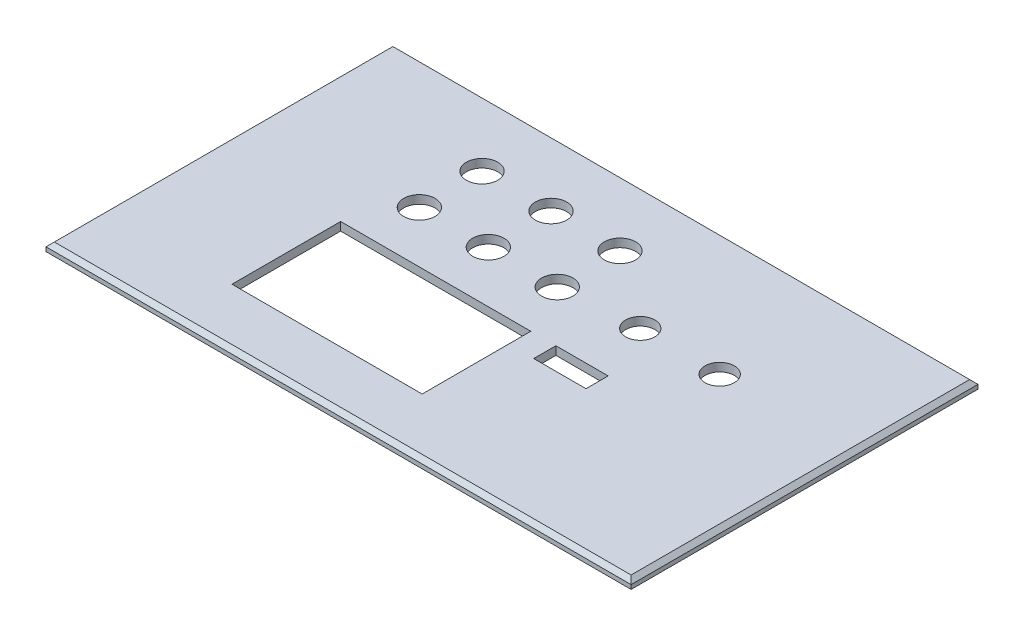
ISO-10303-21;
HEADER;
FILE_DESCRIPTION(('STEP AP214'),'2;1');
FILE_NAME('part.step','',(''),(''),'','','');
FILE_SCHEMA(('AUTOMOTIVE_DESIGN { 1 0 10303 214 1 1 1 1 }'));
ENDSEC;
DATA;
#1=APPLICATION_CONTEXT('core data for automotive mechanical design processes');
#2=APPLICATION_PROTOCOL_DEFINITION('international standard','automotive_design',2000,#1);
#3=PRODUCT_CONTEXT('',#1,'mechanical');
#4=PRODUCT('Part','Part','',(#3));
#5=PRODUCT_RELATED_PRODUCT_CATEGORY('part','',(#4));
#6=PRODUCT_DEFINITION_FORMATION('','',#4);
#7=PRODUCT_DEFINITION_CONTEXT('part definition',#1,'design');
#8=PRODUCT_DEFINITION('design','',#6,#7);
#9=PRODUCT_DEFINITION_SHAPE('','',#8);
#10=(LENGTH_UNIT() NAMED_UNIT(*) SI_UNIT(.MILLI.,.METRE.));
#11=(NAMED_UNIT(*) PLANE_ANGLE_UNIT() SI_UNIT($,.RADIAN.));
#12=(NAMED_UNIT(*) SI_UNIT($,.STERADIAN.) SOLID_ANGLE_UNIT());
#13=UNCERTAINTY_MEASURE_WITH_UNIT(LENGTH_MEASURE(1.E-05),#10,'distance_accuracy_value','');
#14=(GEOMETRIC_REPRESENTATION_CONTEXT(3) GLOBAL_UNCERTAINTY_ASSIGNED_CONTEXT((#13)) GLOBAL_UNIT_ASSIGNED_CONTEXT((#10,
#11,#12)) REPRESENTATION_CONTEXT('',''));
#15=CARTESIAN_POINT('',(0.,0.,0.));
#16=DIRECTION('',(0.,0.,1.));
#17=DIRECTION('',(1.,0.,0.));
#18=AXIS2_PLACEMENT_3D('',#15,#16,#17);
#19=CARTESIAN_POINT('',(0.,2.,0.));
#20=DIRECTION('',(0.,-1.,0.));
#21=DIRECTION('',(0.,0.,-1.));
#22=AXIS2_PLACEMENT_3D('',#19,#20,#21);
#23=PLANE('',#22);
#24=DIRECTION('',(-1.,0.,0.));
#25=VECTOR('',#24,1.);
#26=CARTESIAN_POINT('',(0.,2.,-30.1453744493392));
#27=LINE('',#26,#25);
#28=CARTESIAN_POINT('',(-54.6563876651981,2.,-30.1453744493392));
#29=VERTEX_POINT('',#28);
#30=CARTESIAN_POINT('',(-192.656387665198,2.,-30.1453744493392));
#31=VERTEX_POINT('',#30);
#32=EDGE_CURVE('E329',#29,#31,#27,.T.);
#33=ORIENTED_EDGE('',*,*,#32,.T.);
#34=DIRECTION('',(0.,0.,1.));
#35=VECTOR('',#34,1.);
#36=CARTESIAN_POINT('',(-192.656387665198,2.,0.));
#37=LINE('',#36,#35);
#38=CARTESIAN_POINT('',(-192.656387665198,2.,50.8546255506608));
#39=VERTEX_POINT('',#38);
#40=EDGE_CURVE('E338',#31,#39,#37,.T.);
#41=ORIENTED_EDGE('',*,*,#40,.T.);
#42=DIRECTION('',(1.,0.,0.));
#43=VECTOR('',#42,1.);
#44=CARTESIAN_POINT('',(0.,2.,50.8546255506608));
#45=LINE('',#44,#43);
#46=CARTESIAN_POINT('',(-54.6563876651981,2.,50.8546255506608));
#47=VERTEX_POINT('',#46);
#48=EDGE_CURVE('E335',#39,#47,#45,.T.);
#49=ORIENTED_EDGE('',*,*,#48,.T.);
#50=DIRECTION('',(0.,0.,-1.));
#51=VECTOR('',#50,1.);
#52=CARTESIAN_POINT('',(-54.6563876651981,2.,0.));
#53=LINE('',#52,#51);
#54=EDGE_CURVE('E332',#47,#29,#53,.T.);
#55=ORIENTED_EDGE('',*,*,#54,.T.);
#56=EDGE_LOOP('',(#33,#41,#49,#55));
#57=FACE_BOUND('',#56,.T.);
#58=CARTESIAN_POINT('',(-156.156387665198,2.,0.0224758928179937));
#59=DIRECTION('',(0.,1.,0.));
#60=DIRECTION('',(0.,0.,1.));
#61=AXIS2_PLACEMENT_3D('',#58,#59,#60);
#62=CIRCLE('',#61,3.75000000000004);
#63=CARTESIAN_POINT('',(-156.156387665198,2.,3.77247589281803));
#64=VERTEX_POINT('',#63);
#65=EDGE_CURVE('E195',#64,#64,#62,.T.);
#66=ORIENTED_EDGE('',*,*,#65,.F.);
#67=EDGE_LOOP('',(#66));
#68=FACE_BOUND('',#67,.T.);
#69=CARTESIAN_POINT('',(-139.656387665198,2.,0.0224758928179937));
#70=DIRECTION('',(0.,1.,0.));
#71=DIRECTION('',(0.,0.,1.));
#72=AXIS2_PLACEMENT_3D('',#69,#70,#71);
#73=CIRCLE('',#72,3.75000000000004);
#74=CARTESIAN_POINT('',(-139.656387665198,2.,3.77247589281803));
#75=VERTEX_POINT('',#74);
#76=EDGE_CURVE('E203',#75,#75,#73,.T.);
#77=ORIENTED_EDGE('',*,*,#76,.F.);
#78=EDGE_LOOP('',(#77));
#79=FACE_BOUND('',#78,.T.);
#80=CARTESIAN_POINT('',(-123.156387665198,2.,0.0224758928179937));
#81=DIRECTION('',(0.,1.,0.));
#82=DIRECTION('',(0.,0.,1.));
#83=AXIS2_PLACEMENT_3D('',#80,#81,#82);
#84=CIRCLE('',#83,3.75000000000001);
#85=CARTESIAN_POINT('',(-123.156387665198,2.,3.772475892818));
#86=VERTEX_POINT('',#85);
#87=EDGE_CURVE('E211',#86,#86,#84,.T.);
#88=ORIENTED_EDGE('',*,*,#87,.F.);
#89=EDGE_LOOP('',(#88));
#90=FACE_BOUND('',#89,.T.);
#91=CARTESIAN_POINT('',(-85.6563876651981,2.,-1.33960392078888));
#92=DIRECTION('',(0.,1.,0.));
#93=DIRECTION('',(0.,0.,1.));
#94=AXIS2_PLACEMENT_3D('',#91,#92,#93);
#95=CIRCLE('',#94,3.50000000000001);
#96=CARTESIAN_POINT('',(-85.6563876651981,2.,2.16039607921113));
#97=VERTEX_POINT('',#96);
#98=EDGE_CURVE('E219',#97,#97,#95,.T.);
#99=ORIENTED_EDGE('',*,*,#98,.F.);
#100=EDGE_LOOP('',(#99));
#101=FACE_BOUND('',#100,.T.);
#102=CARTESIAN_POINT('',(-104.656387665198,2.,-1.33960392078888));
#103=DIRECTION('',(0.,1.,0.));
#104=DIRECTION('',(0.,0.,1.));
#105=AXIS2_PLACEMENT_3D('',#102,#103,#104);
#106=CIRCLE('',#105,3.50000000000001);
#107=CARTESIAN_POINT('',(-104.656387665198,2.,2.16039607921112));
#108=VERTEX_POINT('',#107);
#109=EDGE_CURVE('E227',#108,#108,#106,.T.);
#110=ORIENTED_EDGE('',*,*,#109,.F.);
#111=EDGE_LOOP('',(#110));
#112=FACE_BOUND('',#111,.T.);
#113=CARTESIAN_POINT('',(-123.156387665198,2.,-14.977524107182));
#114=DIRECTION('',(0.,1.,0.));
#115=DIRECTION('',(0.,0.,1.));
#116=AXIS2_PLACEMENT_3D('',#113,#114,#115);
#117=CIRCLE('',#116,3.75000000000001);
#118=CARTESIAN_POINT('',(-123.156387665198,2.,-11.227524107182));
#119=VERTEX_POINT('',#118);
#120=EDGE_CURVE('E235',#119,#119,#117,.T.);
#121=ORIENTED_EDGE('',*,*,#120,.F.);
#122=EDGE_LOOP('',(#121));
#123=FACE_BOUND('',#122,.T.);
#124=CARTESIAN_POINT('',(-139.656387665198,2.,-14.977524107182));
#125=DIRECTION('',(0.,1.,0.));
#126=DIRECTION('',(0.,0.,1.));
#127=AXIS2_PLACEMENT_3D('',#124,#125,#126);
#128=CIRCLE('',#127,3.75000000000001);
#129=CARTESIAN_POINT('',(-139.656387665198,2.,-11.227524107182));
#130=VERTEX_POINT('',#129);
#131=EDGE_CURVE('E243',#130,#130,#128,.T.);
#132=ORIENTED_EDGE('',*,*,#131,.F.);
#133=EDGE_LOOP('',(#132));
#134=FACE_BOUND('',#133,.T.);
#135=CARTESIAN_POINT('',(-156.156387665198,2.,-14.977524107182));
#136=DIRECTION('',(0.,1.,0.));
#137=DIRECTION('',(0.,0.,1.));
#138=AXIS2_PLACEMENT_3D('',#135,#136,#137);
#139=CIRCLE('',#138,3.75000000000001);
#140=CARTESIAN_POINT('',(-156.156387665198,2.,-11.227524107182));
#141=VERTEX_POINT('',#140);
#142=EDGE_CURVE('E251',#141,#141,#139,.T.);
#143=ORIENTED_EDGE('',*,*,#142,.F.);
#144=EDGE_LOOP('',(#143));
#145=FACE_BOUND('',#144,.T.);
#146=DIRECTION('',(0.,0.,1.));
#147=VECTOR('',#146,1.);
#148=CARTESIAN_POINT('',(-162.656387665198,2.,38.3546255506609));
#149=LINE('',#148,#147);
#150=CARTESIAN_POINT('',(-162.656387665198,2.,12.3546255506609));
#151=VERTEX_POINT('',#150);
#152=CARTESIAN_POINT('',(-162.656387665198,2.,38.3546255506609));
#153=VERTEX_POINT('',#152);
#154=EDGE_CURVE('E259',#151,#153,#149,.T.);
#155=ORIENTED_EDGE('',*,*,#154,.F.);
#156=DIRECTION('',(-1.,0.,0.));
#157=VECTOR('',#156,1.);
#158=CARTESIAN_POINT('',(-162.656387665198,2.,12.3546255506609));
#159=LINE('',#158,#157);
#160=CARTESIAN_POINT('',(-117.156387665198,2.,12.3546255506609));
#161=VERTEX_POINT('',#160);
#162=EDGE_CURVE('E270',#161,#151,#159,.T.);
#163=ORIENTED_EDGE('',*,*,#162,.F.);
#164=DIRECTION('',(0.,0.,-1.));
#165=VECTOR('',#164,1.);
#166=CARTESIAN_POINT('',(-117.156387665198,2.,38.3546255506609));
#167=LINE('',#166,#165);
#168=CARTESIAN_POINT('',(-117.156387665198,2.,38.3546255506609));
#169=VERTEX_POINT('',#168);
#170=EDGE_CURVE('E266',#169,#161,#167,.T.);
#171=ORIENTED_EDGE('',*,*,#170,.F.);
#172=DIRECTION('',(1.,0.,0.));
#173=VECTOR('',#172,1.);
#174=CARTESIAN_POINT('',(-162.656387665198,2.,38.3546255506609));
#175=LINE('',#174,#173);
#176=EDGE_CURVE('E262',#153,#169,#175,.T.);
#177=ORIENTED_EDGE('',*,*,#176,.F.);
#178=EDGE_LOOP('',(#155,#163,#171,#177));
#179=FACE_BOUND('',#178,.T.);
#180=DIRECTION('',(0.,0.,-1.));
#181=VECTOR('',#180,1.);
#182=CARTESIAN_POINT('',(-98.6563876651981,2.,17.6507934900116));
#183=LINE('',#182,#181);
#184=CARTESIAN_POINT('',(-98.6563876651981,2.,17.6507934900116));
#185=VERTEX_POINT('',#184);
#186=CARTESIAN_POINT('',(-98.6563876651981,2.,12.3507934900116));
#187=VERTEX_POINT('',#186);
#188=EDGE_CURVE('E142',#185,#187,#183,.T.);
#189=ORIENTED_EDGE('',*,*,#188,.F.);
#190=DIRECTION('',(1.,0.,0.));
#191=VECTOR('',#190,1.);
#192=CARTESIAN_POINT('',(-98.6563876651981,2.,17.6507934900116));
#193=LINE('',#192,#191);
#194=CARTESIAN_POINT('',(-111.156387665198,2.,17.6507934900116));
#195=VERTEX_POINT('',#194);
#196=EDGE_CURVE('E171',#195,#185,#193,.T.);
#197=ORIENTED_EDGE('',*,*,#196,.F.);
#198=DIRECTION('',(0.,0.,1.));
#199=VECTOR('',#198,1.);
#200=CARTESIAN_POINT('',(-111.156387665198,2.,17.6507934900116));
#201=LINE('',#200,#199);
#202=CARTESIAN_POINT('',(-111.156387665198,2.,12.3507934900116));
#203=VERTEX_POINT('',#202);
#204=EDGE_CURVE('E167',#203,#195,#201,.T.);
#205=ORIENTED_EDGE('',*,*,#204,.F.);
#206=DIRECTION('',(-1.,0.,0.));
#207=VECTOR('',#206,1.);
#208=CARTESIAN_POINT('',(-98.6563876651981,2.,12.3507934900116));
#209=LINE('',#208,#207);
#210=EDGE_CURVE('E153',#187,#203,#209,.T.);
#211=ORIENTED_EDGE('',*,*,#210,.F.);
#212=EDGE_LOOP('',(#189,#197,#205,#211));
#213=FACE_BOUND('',#212,.T.);
#214=ADVANCED_FACE('F39',(#57,#68,#79,#90,#101,#112,#123,#134,#145,#179,#213),#23,.F.);
#215=CARTESIAN_POINT('',(0.,0.,0.));
#216=DIRECTION('',(0.,-1.,0.));
#217=DIRECTION('',(0.,0.,-1.));
#218=AXIS2_PLACEMENT_3D('',#215,#216,#217);
#219=PLANE('',#218);
#220=CARTESIAN_POINT('',(-139.656387665198,0.,0.0224758928179937));
#221=DIRECTION('',(0.,1.,0.));
#222=DIRECTION('',(0.,0.,1.));
#223=AXIS2_PLACEMENT_3D('',#220,#221,#222);
#224=CIRCLE('',#223,3.75000000000004);
#225=CARTESIAN_POINT('',(-139.656387665198,0.,3.77247589281803));
#226=VERTEX_POINT('',#225);
#227=EDGE_CURVE('E199',#226,#226,#224,.T.);
#228=ORIENTED_EDGE('',*,*,#227,.T.);
#229=EDGE_LOOP('',(#228));
#230=FACE_BOUND('',#229,.T.);
#231=CARTESIAN_POINT('',(-85.6563876651981,0.,-1.33960392078888));
#232=DIRECTION('',(0.,1.,0.));
#233=DIRECTION('',(0.,0.,1.));
#234=AXIS2_PLACEMENT_3D('',#231,#232,#233);
#235=CIRCLE('',#234,3.50000000000001);
#236=CARTESIAN_POINT('',(-85.6563876651981,0.,2.16039607921113));
#237=VERTEX_POINT('',#236);
#238=EDGE_CURVE('E215',#237,#237,#235,.T.);
#239=ORIENTED_EDGE('',*,*,#238,.T.);
#240=EDGE_LOOP('',(#239));
#241=FACE_BOUND('',#240,.T.);
#242=CARTESIAN_POINT('',(-123.156387665198,0.,-14.977524107182));
#243=DIRECTION('',(0.,1.,0.));
#244=DIRECTION('',(0.,0.,1.));
#245=AXIS2_PLACEMENT_3D('',#242,#243,#244);
#246=CIRCLE('',#245,3.75000000000001);
#247=CARTESIAN_POINT('',(-123.156387665198,0.,-11.227524107182));
#248=VERTEX_POINT('',#247);
#249=EDGE_CURVE('E231',#248,#248,#246,.T.);
#250=ORIENTED_EDGE('',*,*,#249,.T.);
#251=EDGE_LOOP('',(#250));
#252=FACE_BOUND('',#251,.T.);
#253=CARTESIAN_POINT('',(-156.156387665198,0.,-14.977524107182));
#254=DIRECTION('',(0.,1.,0.));
#255=DIRECTION('',(0.,0.,1.));
#256=AXIS2_PLACEMENT_3D('',#253,#254,#255);
#257=CIRCLE('',#256,3.75000000000001);
#258=CARTESIAN_POINT('',(-156.156387665198,0.,-11.227524107182));
#259=VERTEX_POINT('',#258);
#260=EDGE_CURVE('E247',#259,#259,#257,.T.);
#261=ORIENTED_EDGE('',*,*,#260,.T.);
#262=EDGE_LOOP('',(#261));
#263=FACE_BOUND('',#262,.T.);
#264=DIRECTION('',(0.,0.,-1.));
#265=VECTOR('',#264,1.);
#266=CARTESIAN_POINT('',(-53.6563876651981,0.,-31.1453744493392));
#267=LINE('',#266,#265);
#268=CARTESIAN_POINT('',(-53.6563876651981,0.,51.8546255506608));
#269=VERTEX_POINT('',#268);
#270=CARTESIAN_POINT('',(-53.6563876651981,0.,-31.1453744493392));
#271=VERTEX_POINT('',#270);
#272=EDGE_CURVE('E301',#269,#271,#267,.T.);
#273=ORIENTED_EDGE('',*,*,#272,.F.);
#274=DIRECTION('',(1.,0.,0.));
#275=VECTOR('',#274,1.);
#276=CARTESIAN_POINT('',(-53.6563876651981,0.,51.8546255506608));
#277=LINE('',#276,#275);
#278=CARTESIAN_POINT('',(-193.656387665198,0.,51.8546255506608));
#279=VERTEX_POINT('',#278);
#280=EDGE_CURVE('E313',#279,#269,#277,.T.);
#281=ORIENTED_EDGE('',*,*,#280,.F.);
#282=DIRECTION('',(0.,0.,1.));
#283=VECTOR('',#282,1.);
#284=CARTESIAN_POINT('',(-193.656387665198,0.,-31.1453744493392));
#285=LINE('',#284,#283);
#286=CARTESIAN_POINT('',(-193.656387665198,0.,-31.1453744493392));
#287=VERTEX_POINT('',#286);
#288=EDGE_CURVE('E309',#287,#279,#285,.T.);
#289=ORIENTED_EDGE('',*,*,#288,.F.);
#290=DIRECTION('',(-1.,0.,0.));
#291=VECTOR('',#290,1.);
#292=CARTESIAN_POINT('',(-53.6563876651981,0.,-31.1453744493392));
#293=LINE('',#292,#291);
#294=EDGE_CURVE('E305',#271,#287,#293,.T.);
#295=ORIENTED_EDGE('',*,*,#294,.F.);
#296=EDGE_LOOP('',(#273,#281,#289,#295));
#297=FACE_BOUND('',#296,.T.);
#298=DIRECTION('',(-1.,0.,0.));
#299=VECTOR('',#298,1.);
#300=CARTESIAN_POINT('',(-162.656387665198,0.,12.3546255506609));
#301=LINE('',#300,#299);
#302=CARTESIAN_POINT('',(-117.156387665198,0.,12.3546255506609));
#303=VERTEX_POINT('',#302);
#304=CARTESIAN_POINT('',(-162.656387665198,0.,12.3546255506609));
#305=VERTEX_POINT('',#304);
#306=EDGE_CURVE('E263',#303,#305,#301,.T.);
#307=ORIENTED_EDGE('',*,*,#306,.T.);
#308=DIRECTION('',(0.,0.,1.));
#309=VECTOR('',#308,1.);
#310=CARTESIAN_POINT('',(-162.656387665198,0.,38.3546255506609));
#311=LINE('',#310,#309);
#312=CARTESIAN_POINT('',(-162.656387665198,0.,38.3546255506609));
#313=VERTEX_POINT('',#312);
#314=EDGE_CURVE('E255',#305,#313,#311,.T.);
#315=ORIENTED_EDGE('',*,*,#314,.T.);
#316=DIRECTION('',(1.,0.,0.));
#317=VECTOR('',#316,1.);
#318=CARTESIAN_POINT('',(-162.656387665198,0.,38.3546255506609));
#319=LINE('',#318,#317);
#320=CARTESIAN_POINT('',(-117.156387665198,0.,38.3546255506609));
#321=VERTEX_POINT('',#320);
#322=EDGE_CURVE('E277',#313,#321,#319,.T.);
#323=ORIENTED_EDGE('',*,*,#322,.T.);
#324=DIRECTION('',(0.,0.,-1.));
#325=VECTOR('',#324,1.);
#326=CARTESIAN_POINT('',(-117.156387665198,0.,38.3546255506609));
#327=LINE('',#326,#325);
#328=EDGE_CURVE('E281',#321,#303,#327,.T.);
#329=ORIENTED_EDGE('',*,*,#328,.T.);
#330=EDGE_LOOP('',(#307,#315,#323,#329));
#331=FACE_BOUND('',#330,.T.);
#332=CARTESIAN_POINT('',(-139.656387665198,0.,-14.977524107182));
#333=DIRECTION('',(0.,1.,0.));
#334=DIRECTION('',(0.,0.,1.));
#335=AXIS2_PLACEMENT_3D('',#332,#333,#334);
#336=CIRCLE('',#335,3.75000000000001);
#337=CARTESIAN_POINT('',(-139.656387665198,0.,-11.227524107182));
#338=VERTEX_POINT('',#337);
#339=EDGE_CURVE('E239',#338,#338,#336,.T.);
#340=ORIENTED_EDGE('',*,*,#339,.T.);
#341=EDGE_LOOP('',(#340));
#342=FACE_BOUND('',#341,.T.);
#343=CARTESIAN_POINT('',(-104.656387665198,0.,-1.33960392078888));
#344=DIRECTION('',(0.,1.,0.));
#345=DIRECTION('',(0.,0.,1.));
#346=AXIS2_PLACEMENT_3D('',#343,#344,#345);
#347=CIRCLE('',#346,3.50000000000001);
#348=CARTESIAN_POINT('',(-104.656387665198,0.,2.16039607921112));
#349=VERTEX_POINT('',#348);
#350=EDGE_CURVE('E223',#349,#349,#347,.T.);
#351=ORIENTED_EDGE('',*,*,#350,.T.);
#352=EDGE_LOOP('',(#351));
#353=FACE_BOUND('',#352,.T.);
#354=CARTESIAN_POINT('',(-123.156387665198,0.,0.0224758928179937));
#355=DIRECTION('',(0.,1.,0.));
#356=DIRECTION('',(0.,0.,1.));
#357=AXIS2_PLACEMENT_3D('',#354,#355,#356);
#358=CIRCLE('',#357,3.75000000000001);
#359=CARTESIAN_POINT('',(-123.156387665198,0.,3.772475892818));
#360=VERTEX_POINT('',#359);
#361=EDGE_CURVE('E207',#360,#360,#358,.T.);
#362=ORIENTED_EDGE('',*,*,#361,.T.);
#363=EDGE_LOOP('',(#362));
#364=FACE_BOUND('',#363,.T.);
#365=CARTESIAN_POINT('',(-156.156387665198,0.,0.0224758928179937));
#366=DIRECTION('',(0.,1.,0.));
#367=DIRECTION('',(0.,0.,1.));
#368=AXIS2_PLACEMENT_3D('',#365,#366,#367);
#369=CIRCLE('',#368,3.75000000000004);
#370=CARTESIAN_POINT('',(-156.156387665198,0.,3.77247589281803));
#371=VERTEX_POINT('',#370);
#372=EDGE_CURVE('E162',#371,#371,#369,.T.);
#373=ORIENTED_EDGE('',*,*,#372,.T.);
#374=EDGE_LOOP('',(#373));
#375=FACE_BOUND('',#374,.T.);
#376=DIRECTION('',(1.,0.,0.));
#377=VECTOR('',#376,1.);
#378=CARTESIAN_POINT('',(-98.6563876651981,0.,17.6507934900116));
#379=LINE('',#378,#377);
#380=CARTESIAN_POINT('',(-111.156387665198,0.,17.6507934900116));
#381=VERTEX_POINT('',#380);
#382=CARTESIAN_POINT('',(-98.6563876651981,0.,17.6507934900116));
#383=VERTEX_POINT('',#382);
#384=EDGE_CURVE('E154',#381,#383,#379,.T.);
#385=ORIENTED_EDGE('',*,*,#384,.T.);
#386=DIRECTION('',(0.,0.,-1.));
#387=VECTOR('',#386,1.);
#388=CARTESIAN_POINT('',(-98.6563876651981,0.,17.6507934900116));
#389=LINE('',#388,#387);
#390=CARTESIAN_POINT('',(-98.6563876651981,0.,12.3507934900116));
#391=VERTEX_POINT('',#390);
#392=EDGE_CURVE('E176',#383,#391,#389,.T.);
#393=ORIENTED_EDGE('',*,*,#392,.T.);
#394=DIRECTION('',(-1.,0.,0.));
#395=VECTOR('',#394,1.);
#396=CARTESIAN_POINT('',(-98.6563876651981,0.,12.3507934900116));
#397=LINE('',#396,#395);
#398=CARTESIAN_POINT('',(-111.156387665198,0.,12.3507934900116));
#399=VERTEX_POINT('',#398);
#400=EDGE_CURVE('E160',#391,#399,#397,.T.);
#401=ORIENTED_EDGE('',*,*,#400,.T.);
#402=DIRECTION('',(0.,0.,1.));
#403=VECTOR('',#402,1.);
#404=CARTESIAN_POINT('',(-111.156387665198,0.,17.6507934900116));
#405=LINE('',#404,#403);
#406=EDGE_CURVE('E181',#399,#381,#405,.T.);
#407=ORIENTED_EDGE('',*,*,#406,.T.);
#408=EDGE_LOOP('',(#385,#393,#401,#407));
#409=FACE_BOUND('',#408,.T.);
#410=ADVANCED_FACE('F388',(#230,#241,#252,#263,#297,#331,#342,#353,#364,#375,#409),#219,.T.);
#411=CARTESIAN_POINT('',(-53.6563876651981,2.,-31.1453744493392));
#412=DIRECTION('',(-1.,0.,0.));
#413=DIRECTION('',(0.,0.,1.));
#414=AXIS2_PLACEMENT_3D('',#411,#412,#413);
#415=PLANE('',#414);
#416=DIRECTION('',(0.,-1.,0.));
#417=VECTOR('',#416,1.);
#418=CARTESIAN_POINT('',(-53.6563876651981,2.,-31.1453744493392));
#419=LINE('',#418,#417);
#420=CARTESIAN_POINT('',(-53.6563876651981,0.999999999999999,-31.1453744493392));
#421=VERTEX_POINT('',#420);
#422=EDGE_CURVE('E326',#421,#271,#419,.T.);
#423=ORIENTED_EDGE('',*,*,#422,.F.);
#424=DIRECTION('',(0.,0.,1.));
#425=VECTOR('',#424,1.);
#426=CARTESIAN_POINT('',(-53.6563876651981,0.999999999999999,-31.1453744493392));
#427=LINE('',#426,#425);
#428=CARTESIAN_POINT('',(-53.6563876651981,0.999999999999999,51.8546255506608));
#429=VERTEX_POINT('',#428);
#430=EDGE_CURVE('E49',#421,#429,#427,.T.);
#431=ORIENTED_EDGE('',*,*,#430,.T.);
#432=DIRECTION('',(0.,-1.,0.));
#433=VECTOR('',#432,1.);
#434=CARTESIAN_POINT('',(-53.6563876651981,2.,51.8546255506608));
#435=LINE('',#434,#433);
#436=EDGE_CURVE('E317',#429,#269,#435,.T.);
#437=ORIENTED_EDGE('',*,*,#436,.T.);
#438=ORIENTED_EDGE('',*,*,#272,.T.);
#439=EDGE_LOOP('',(#423,#431,#437,#438));
#440=FACE_BOUND('',#439,.T.);
#441=ADVANCED_FACE('F440',(#440),#415,.F.);
#442=CARTESIAN_POINT('',(-53.6563876651981,2.,-31.1453744493392));
#443=DIRECTION('',(0.,0.,1.));
#444=DIRECTION('',(1.,0.,0.));
#445=AXIS2_PLACEMENT_3D('',#442,#443,#444);
#446=PLANE('',#445);
#447=DIRECTION('',(0.,-1.,0.));
#448=VECTOR('',#447,1.);
#449=CARTESIAN_POINT('',(-193.656387665198,2.,-31.1453744493392));
#450=LINE('',#449,#448);
#451=CARTESIAN_POINT('',(-193.656387665198,0.999999999999999,-31.1453744493392));
#452=VERTEX_POINT('',#451);
#453=EDGE_CURVE('E323',#452,#287,#450,.T.);
#454=ORIENTED_EDGE('',*,*,#453,.F.);
#455=DIRECTION('',(1.,0.,0.));
#456=VECTOR('',#455,1.);
#457=CARTESIAN_POINT('',(-53.6563876651981,0.999999999999999,-31.1453744493392));
#458=LINE('',#457,#456);
#459=EDGE_CURVE('E11',#452,#421,#458,.T.);
#460=ORIENTED_EDGE('',*,*,#459,.T.);
#461=ORIENTED_EDGE('',*,*,#422,.T.);
#462=ORIENTED_EDGE('',*,*,#294,.T.);
#463=EDGE_LOOP('',(#454,#460,#461,#462));
#464=FACE_BOUND('',#463,.T.);
#465=ADVANCED_FACE('F446',(#464),#446,.F.);
#466=CARTESIAN_POINT('',(-193.656387665198,2.,-31.1453744493392));
#467=DIRECTION('',(1.,0.,0.));
#468=DIRECTION('',(0.,0.,-1.));
#469=AXIS2_PLACEMENT_3D('',#466,#467,#468);
#470=PLANE('',#469);
#471=DIRECTION('',(0.,-1.,0.));
#472=VECTOR('',#471,1.);
#473=CARTESIAN_POINT('',(-193.656387665198,2.,51.8546255506608));
#474=LINE('',#473,#472);
#475=CARTESIAN_POINT('',(-193.656387665198,0.999999999999999,51.8546255506608));
#476=VERTEX_POINT('',#475);
#477=EDGE_CURVE('E320',#476,#279,#474,.T.);
#478=ORIENTED_EDGE('',*,*,#477,.F.);
#479=DIRECTION('',(0.,0.,-1.));
#480=VECTOR('',#479,1.);
#481=CARTESIAN_POINT('',(-193.656387665198,0.999999999999999,-31.1453744493392));
#482=LINE('',#481,#480);
#483=EDGE_CURVE('E342',#476,#452,#482,.T.);
#484=ORIENTED_EDGE('',*,*,#483,.T.);
#485=ORIENTED_EDGE('',*,*,#453,.T.);
#486=ORIENTED_EDGE('',*,*,#288,.T.);
#487=EDGE_LOOP('',(#478,#484,#485,#486));
#488=FACE_BOUND('',#487,.T.);
#489=ADVANCED_FACE('F379',(#488),#470,.F.);
#490=CARTESIAN_POINT('',(-53.6563876651981,2.,51.8546255506608));
#491=DIRECTION('',(0.,0.,-1.));
#492=DIRECTION('',(-1.,0.,0.));
#493=AXIS2_PLACEMENT_3D('',#490,#491,#492);
#494=PLANE('',#493);
#495=ORIENTED_EDGE('',*,*,#436,.F.);
#496=DIRECTION('',(-1.,0.,0.));
#497=VECTOR('',#496,1.);
#498=CARTESIAN_POINT('',(-53.6563876651981,0.999999999999999,51.8546255506608));
#499=LINE('',#498,#497);
#500=EDGE_CURVE('E346',#429,#476,#499,.T.);
#501=ORIENTED_EDGE('',*,*,#500,.T.);
#502=ORIENTED_EDGE('',*,*,#477,.T.);
#503=ORIENTED_EDGE('',*,*,#280,.T.);
#504=EDGE_LOOP('',(#495,#501,#502,#503));
#505=FACE_BOUND('',#504,.T.);
#506=ADVANCED_FACE('F376',(#505),#494,.F.);
#507=CARTESIAN_POINT('',(-162.656387665198,2.,38.3546255506609));
#508=DIRECTION('',(1.,0.,0.));
#509=DIRECTION('',(0.,0.,-1.));
#510=AXIS2_PLACEMENT_3D('',#507,#508,#509);
#511=PLANE('',#510);
#512=ORIENTED_EDGE('',*,*,#314,.F.);
#513=DIRECTION('',(0.,-1.,0.));
#514=VECTOR('',#513,1.);
#515=CARTESIAN_POINT('',(-162.656387665198,2.,12.3546255506609));
#516=LINE('',#515,#514);
#517=EDGE_CURVE('E273',#151,#305,#516,.T.);
#518=ORIENTED_EDGE('',*,*,#517,.F.);
#519=ORIENTED_EDGE('',*,*,#154,.T.);
#520=DIRECTION('',(0.,-1.,0.));
#521=VECTOR('',#520,1.);
#522=CARTESIAN_POINT('',(-162.656387665198,2.,38.3546255506609));
#523=LINE('',#522,#521);
#524=EDGE_CURVE('E297',#153,#313,#523,.T.);
#525=ORIENTED_EDGE('',*,*,#524,.T.);
#526=EDGE_LOOP('',(#512,#518,#519,#525));
#527=FACE_BOUND('',#526,.T.);
#528=ADVANCED_FACE('F413',(#527),#511,.T.);
#529=CARTESIAN_POINT('',(-162.656387665198,2.,38.3546255506609));
#530=DIRECTION('',(0.,0.,-1.));
#531=DIRECTION('',(-1.,0.,0.));
#532=AXIS2_PLACEMENT_3D('',#529,#530,#531);
#533=PLANE('',#532);
#534=ORIENTED_EDGE('',*,*,#322,.F.);
#535=ORIENTED_EDGE('',*,*,#524,.F.);
#536=ORIENTED_EDGE('',*,*,#176,.T.);
#537=DIRECTION('',(0.,-1.,0.));
#538=VECTOR('',#537,1.);
#539=CARTESIAN_POINT('',(-117.156387665198,2.,38.3546255506609));
#540=LINE('',#539,#538);
#541=EDGE_CURVE('E294',#169,#321,#540,.T.);
#542=ORIENTED_EDGE('',*,*,#541,.T.);
#543=EDGE_LOOP('',(#534,#535,#536,#542));
#544=FACE_BOUND('',#543,.T.);
#545=ADVANCED_FACE('F415',(#544),#533,.T.);
#546=CARTESIAN_POINT('',(-117.156387665198,2.,38.3546255506609));
#547=DIRECTION('',(-1.,0.,0.));
#548=DIRECTION('',(0.,0.,1.));
#549=AXIS2_PLACEMENT_3D('',#546,#547,#548);
#550=PLANE('',#549);
#551=ORIENTED_EDGE('',*,*,#328,.F.);
#552=ORIENTED_EDGE('',*,*,#541,.F.);
#553=ORIENTED_EDGE('',*,*,#170,.T.);
#554=DIRECTION('',(0.,-1.,0.));
#555=VECTOR('',#554,1.);
#556=CARTESIAN_POINT('',(-117.156387665198,2.,12.3546255506609));
#557=LINE('',#556,#555);
#558=EDGE_CURVE('E291',#161,#303,#557,.T.);
#559=ORIENTED_EDGE('',*,*,#558,.T.);
#560=EDGE_LOOP('',(#551,#552,#553,#559));
#561=FACE_BOUND('',#560,.T.);
#562=ADVANCED_FACE('F424',(#561),#550,.T.);
#563=CARTESIAN_POINT('',(-162.656387665198,2.,12.3546255506609));
#564=DIRECTION('',(0.,0.,1.));
#565=DIRECTION('',(1.,0.,0.));
#566=AXIS2_PLACEMENT_3D('',#563,#564,#565);
#567=PLANE('',#566);
#568=ORIENTED_EDGE('',*,*,#306,.F.);
#569=ORIENTED_EDGE('',*,*,#558,.F.);
#570=ORIENTED_EDGE('',*,*,#162,.T.);
#571=ORIENTED_EDGE('',*,*,#517,.T.);
#572=EDGE_LOOP('',(#568,#569,#570,#571));
#573=FACE_BOUND('',#572,.T.);
#574=ADVANCED_FACE('F422',(#573),#567,.T.);
#575=CARTESIAN_POINT('',(-156.156387665198,2.,-14.977524107182));
#576=DIRECTION('',(0.,-1.,0.));
#577=DIRECTION('',(0.,0.,-1.));
#578=AXIS2_PLACEMENT_3D('',#575,#576,#577);
#579=CYLINDRICAL_SURFACE('',#578,3.75000000000001);
#580=ORIENTED_EDGE('',*,*,#142,.T.);
#581=EDGE_LOOP('',(#580));
#582=FACE_BOUND('',#581,.T.);
#583=ORIENTED_EDGE('',*,*,#260,.F.);
#584=EDGE_LOOP('',(#583));
#585=FACE_BOUND('',#584,.T.);
#586=ADVANCED_FACE('F431',(#582,#585),#579,.F.);
#587=CARTESIAN_POINT('',(-139.656387665198,2.,-14.977524107182));
#588=DIRECTION('',(0.,-1.,0.));
#589=DIRECTION('',(0.,0.,-1.));
#590=AXIS2_PLACEMENT_3D('',#587,#588,#589);
#591=CYLINDRICAL_SURFACE('',#590,3.75000000000001);
#592=ORIENTED_EDGE('',*,*,#131,.T.);
#593=EDGE_LOOP('',(#592));
#594=FACE_BOUND('',#593,.T.);
#595=ORIENTED_EDGE('',*,*,#339,.F.);
#596=EDGE_LOOP('',(#595));
#597=FACE_BOUND('',#596,.T.);
#598=ADVANCED_FACE('F499',(#594,#597),#591,.F.);
#599=CARTESIAN_POINT('',(-123.156387665198,2.,-14.977524107182));
#600=DIRECTION('',(0.,-1.,0.));
#601=DIRECTION('',(0.,0.,-1.));
#602=AXIS2_PLACEMENT_3D('',#599,#600,#601);
#603=CYLINDRICAL_SURFACE('',#602,3.75000000000001);
#604=ORIENTED_EDGE('',*,*,#120,.T.);
#605=EDGE_LOOP('',(#604));
#606=FACE_BOUND('',#605,.T.);
#607=ORIENTED_EDGE('',*,*,#249,.F.);
#608=EDGE_LOOP('',(#607));
#609=FACE_BOUND('',#608,.T.);
#610=ADVANCED_FACE('F495',(#606,#609),#603,.F.);
#611=CARTESIAN_POINT('',(-104.656387665198,2.,-1.33960392078888));
#612=DIRECTION('',(0.,-1.,0.));
#613=DIRECTION('',(0.,0.,-1.));
#614=AXIS2_PLACEMENT_3D('',#611,#612,#613);
#615=CYLINDRICAL_SURFACE('',#614,3.50000000000001);
#616=ORIENTED_EDGE('',*,*,#109,.T.);
#617=EDGE_LOOP('',(#616));
#618=FACE_BOUND('',#617,.T.);
#619=ORIENTED_EDGE('',*,*,#350,.F.);
#620=EDGE_LOOP('',(#619));
#621=FACE_BOUND('',#620,.T.);
#622=ADVANCED_FACE('F491',(#618,#621),#615,.F.);
#623=CARTESIAN_POINT('',(-85.6563876651981,2.,-1.33960392078888));
#624=DIRECTION('',(0.,-1.,0.));
#625=DIRECTION('',(0.,0.,-1.));
#626=AXIS2_PLACEMENT_3D('',#623,#624,#625);
#627=CYLINDRICAL_SURFACE('',#626,3.50000000000001);
#628=ORIENTED_EDGE('',*,*,#98,.T.);
#629=EDGE_LOOP('',(#628));
#630=FACE_BOUND('',#629,.T.);
#631=ORIENTED_EDGE('',*,*,#238,.F.);
#632=EDGE_LOOP('',(#631));
#633=FACE_BOUND('',#632,.T.);
#634=ADVANCED_FACE('F487',(#630,#633),#627,.F.);
#635=CARTESIAN_POINT('',(-123.156387665198,2.,0.0224758928179937));
#636=DIRECTION('',(0.,-1.,0.));
#637=DIRECTION('',(0.,0.,-1.));
#638=AXIS2_PLACEMENT_3D('',#635,#636,#637);
#639=CYLINDRICAL_SURFACE('',#638,3.75000000000001);
#640=ORIENTED_EDGE('',*,*,#87,.T.);
#641=EDGE_LOOP('',(#640));
#642=FACE_BOUND('',#641,.T.);
#643=ORIENTED_EDGE('',*,*,#361,.F.);
#644=EDGE_LOOP('',(#643));
#645=FACE_BOUND('',#644,.T.);
#646=ADVANCED_FACE('F483',(#642,#645),#639,.F.);
#647=CARTESIAN_POINT('',(-139.656387665198,2.,0.0224758928179937));
#648=DIRECTION('',(0.,-1.,0.));
#649=DIRECTION('',(0.,0.,-1.));
#650=AXIS2_PLACEMENT_3D('',#647,#648,#649);
#651=CYLINDRICAL_SURFACE('',#650,3.75000000000004);
#652=ORIENTED_EDGE('',*,*,#76,.T.);
#653=EDGE_LOOP('',(#652));
#654=FACE_BOUND('',#653,.T.);
#655=ORIENTED_EDGE('',*,*,#227,.F.);
#656=EDGE_LOOP('',(#655));
#657=FACE_BOUND('',#656,.T.);
#658=ADVANCED_FACE('F479',(#654,#657),#651,.F.);
#659=CARTESIAN_POINT('',(-156.156387665198,2.,0.0224758928179937));
#660=DIRECTION('',(0.,-1.,0.));
#661=DIRECTION('',(0.,0.,-1.));
#662=AXIS2_PLACEMENT_3D('',#659,#660,#661);
#663=CYLINDRICAL_SURFACE('',#662,3.75000000000004);
#664=ORIENTED_EDGE('',*,*,#65,.T.);
#665=EDGE_LOOP('',(#664));
#666=FACE_BOUND('',#665,.T.);
#667=ORIENTED_EDGE('',*,*,#372,.F.);
#668=EDGE_LOOP('',(#667));
#669=FACE_BOUND('',#668,.T.);
#670=ADVANCED_FACE('F476',(#666,#669),#663,.F.);
#671=CARTESIAN_POINT('',(-98.6563876651981,2.,17.6507934900116));
#672=DIRECTION('',(-1.,0.,0.));
#673=DIRECTION('',(0.,0.,1.));
#674=AXIS2_PLACEMENT_3D('',#671,#672,#673);
#675=PLANE('',#674);
#676=ORIENTED_EDGE('',*,*,#392,.F.);
#677=DIRECTION('',(0.,-1.,0.));
#678=VECTOR('',#677,1.);
#679=CARTESIAN_POINT('',(-98.6563876651981,2.,17.6507934900116));
#680=LINE('',#679,#678);
#681=EDGE_CURVE('E148',#185,#383,#680,.T.);
#682=ORIENTED_EDGE('',*,*,#681,.F.);
#683=ORIENTED_EDGE('',*,*,#188,.T.);
#684=DIRECTION('',(0.,-1.,0.));
#685=VECTOR('',#684,1.);
#686=CARTESIAN_POINT('',(-98.6563876651981,2.,12.3507934900116));
#687=LINE('',#686,#685);
#688=EDGE_CURVE('E145',#187,#391,#687,.T.);
#689=ORIENTED_EDGE('',*,*,#688,.T.);
#690=EDGE_LOOP('',(#676,#682,#683,#689));
#691=FACE_BOUND('',#690,.T.);
#692=ADVANCED_FACE('F144',(#691),#675,.T.);
#693=CARTESIAN_POINT('',(-98.6563876651981,2.,12.3507934900116));
#694=DIRECTION('',(0.,0.,1.));
#695=DIRECTION('',(1.,0.,0.));
#696=AXIS2_PLACEMENT_3D('',#693,#694,#695);
#697=PLANE('',#696);
#698=ORIENTED_EDGE('',*,*,#400,.F.);
#699=ORIENTED_EDGE('',*,*,#688,.F.);
#700=ORIENTED_EDGE('',*,*,#210,.T.);
#701=DIRECTION('',(0.,-1.,0.));
#702=VECTOR('',#701,1.);
#703=CARTESIAN_POINT('',(-111.156387665198,2.,12.3507934900116));
#704=LINE('',#703,#702);
#705=EDGE_CURVE('E163',#203,#399,#704,.T.);
#706=ORIENTED_EDGE('',*,*,#705,.T.);
#707=EDGE_LOOP('',(#698,#699,#700,#706));
#708=FACE_BOUND('',#707,.T.);
#709=ADVANCED_FACE('F157',(#708),#697,.T.);
#710=CARTESIAN_POINT('',(-111.156387665198,2.,17.6507934900116));
#711=DIRECTION('',(1.,0.,0.));
#712=DIRECTION('',(0.,0.,-1.));
#713=AXIS2_PLACEMENT_3D('',#710,#711,#712);
#714=PLANE('',#713);
#715=ORIENTED_EDGE('',*,*,#406,.F.);
#716=ORIENTED_EDGE('',*,*,#705,.F.);
#717=ORIENTED_EDGE('',*,*,#204,.T.);
#718=DIRECTION('',(0.,-1.,0.));
#719=VECTOR('',#718,1.);
#720=CARTESIAN_POINT('',(-111.156387665198,2.,17.6507934900116));
#721=LINE('',#720,#719);
#722=EDGE_CURVE('E190',#195,#381,#721,.T.);
#723=ORIENTED_EDGE('',*,*,#722,.T.);
#724=EDGE_LOOP('',(#715,#716,#717,#723));
#725=FACE_BOUND('',#724,.T.);
#726=ADVANCED_FACE('F462',(#725),#714,.T.);
#727=CARTESIAN_POINT('',(-98.6563876651981,2.,17.6507934900116));
#728=DIRECTION('',(0.,0.,-1.));
#729=DIRECTION('',(-1.,0.,0.));
#730=AXIS2_PLACEMENT_3D('',#727,#728,#729);
#731=PLANE('',#730);
#732=ORIENTED_EDGE('',*,*,#384,.F.);
#733=ORIENTED_EDGE('',*,*,#722,.F.);
#734=ORIENTED_EDGE('',*,*,#196,.T.);
#735=ORIENTED_EDGE('',*,*,#681,.T.);
#736=EDGE_LOOP('',(#732,#733,#734,#735));
#737=FACE_BOUND('',#736,.T.);
#738=ADVANCED_FACE('F458',(#737),#731,.T.);
#739=CARTESIAN_POINT('',(-54.6563876651981,2.,0.));
#740=DIRECTION('',(-0.707106781186549,-0.707106781186546,0.));
#741=DIRECTION('',(0.,0.,-1.));
#742=AXIS2_PLACEMENT_3D('',#739,#740,#741);
#743=PLANE('',#742);
#744=DIRECTION('',(0.577350269189624,-0.577350269189626,0.577350269189627));
#745=VECTOR('',#744,1.);
#746=CARTESIAN_POINT('',(-71.6079295154184,18.9515418502203,33.9030837004405));
#747=LINE('',#746,#745);
#748=EDGE_CURVE('E356',#429,#47,#747,.F.);
#749=ORIENTED_EDGE('',*,*,#748,.F.);
#750=ORIENTED_EDGE('',*,*,#430,.F.);
#751=DIRECTION('',(0.577350269189624,-0.577350269189627,-0.577350269189627));
#752=VECTOR('',#751,1.);
#753=CARTESIAN_POINT('',(-36.4375917767989,-16.2187958883993,-48.3641703377385));
#754=LINE('',#753,#752);
#755=EDGE_CURVE('E43',#29,#421,#754,.T.);
#756=ORIENTED_EDGE('',*,*,#755,.F.);
#757=ORIENTED_EDGE('',*,*,#54,.F.);
#758=EDGE_LOOP('',(#749,#750,#756,#757));
#759=FACE_BOUND('',#758,.T.);
#760=ADVANCED_FACE('F41',(#759),#743,.F.);
#761=CARTESIAN_POINT('',(0.,2.,-30.1453744493392));
#762=DIRECTION('',(0.,-0.707106781186547,0.707106781186547));
#763=DIRECTION('',(-1.,0.,0.));
#764=AXIS2_PLACEMENT_3D('',#761,#762,#763);
#765=PLANE('',#764);
#766=ORIENTED_EDGE('',*,*,#755,.T.);
#767=ORIENTED_EDGE('',*,*,#459,.F.);
#768=DIRECTION('',(0.577350269189626,0.577350269189626,0.577350269189626));
#769=VECTOR('',#768,1.);
#770=CARTESIAN_POINT('',(-128.437591776799,66.2187958883994,34.0734214390602));
#771=LINE('',#770,#769);
#772=EDGE_CURVE('E354',#31,#452,#771,.F.);
#773=ORIENTED_EDGE('',*,*,#772,.F.);
#774=ORIENTED_EDGE('',*,*,#32,.F.);
#775=EDGE_LOOP('',(#766,#767,#773,#774));
#776=FACE_BOUND('',#775,.T.);
#777=ADVANCED_FACE('F368',(#776),#765,.F.);
#778=CARTESIAN_POINT('',(0.,2.,50.8546255506608));
#779=DIRECTION('',(0.,-0.707106781186548,-0.707106781186547));
#780=DIRECTION('',(1.,0.,0.));
#781=AXIS2_PLACEMENT_3D('',#778,#779,#780);
#782=PLANE('',#781);
#783=ORIENTED_EDGE('',*,*,#748,.T.);
#784=ORIENTED_EDGE('',*,*,#48,.F.);
#785=DIRECTION('',(-0.577350269189625,-0.577350269189626,0.577350269189626));
#786=VECTOR('',#785,1.);
#787=CARTESIAN_POINT('',(-128.437591776799,66.2187958883993,-13.3641703377386));
#788=LINE('',#787,#786);
#789=EDGE_CURVE('E351',#476,#39,#788,.F.);
#790=ORIENTED_EDGE('',*,*,#789,.F.);
#791=ORIENTED_EDGE('',*,*,#500,.F.);
#792=EDGE_LOOP('',(#783,#784,#790,#791));
#793=FACE_BOUND('',#792,.T.);
#794=ADVANCED_FACE('F373',(#793),#782,.F.);
#795=CARTESIAN_POINT('',(-192.656387665198,2.,0.));
#796=DIRECTION('',(0.707106781186547,-0.707106781186547,0.));
#797=DIRECTION('',(0.,0.,1.));
#798=AXIS2_PLACEMENT_3D('',#795,#796,#797);
#799=PLANE('',#798);
#800=ORIENTED_EDGE('',*,*,#772,.T.);
#801=ORIENTED_EDGE('',*,*,#483,.F.);
#802=ORIENTED_EDGE('',*,*,#789,.T.);
#803=ORIENTED_EDGE('',*,*,#40,.F.);
#804=EDGE_LOOP('',(#800,#801,#802,#803));
#805=FACE_BOUND('',#804,.T.);
#806=ADVANCED_FACE('F383',(#805),#799,.F.);
#807=CLOSED_SHELL('',(#214,#410,#441,#465,#489,#506,#528,#545,#562,#574,#586,#598,#610,#622,
#634,#646,#658,#670,#692,#709,#726,#738,#760,#777,#794,#806));
#808=MANIFOLD_SOLID_BREP('B2',#807);
#809=ADVANCED_BREP_SHAPE_REPRESENTATION('',(#18,#808),#14);
#810=SHAPE_DEFINITION_REPRESENTATION(#9,#809);
ENDSEC;
END-ISO-10303-21;
